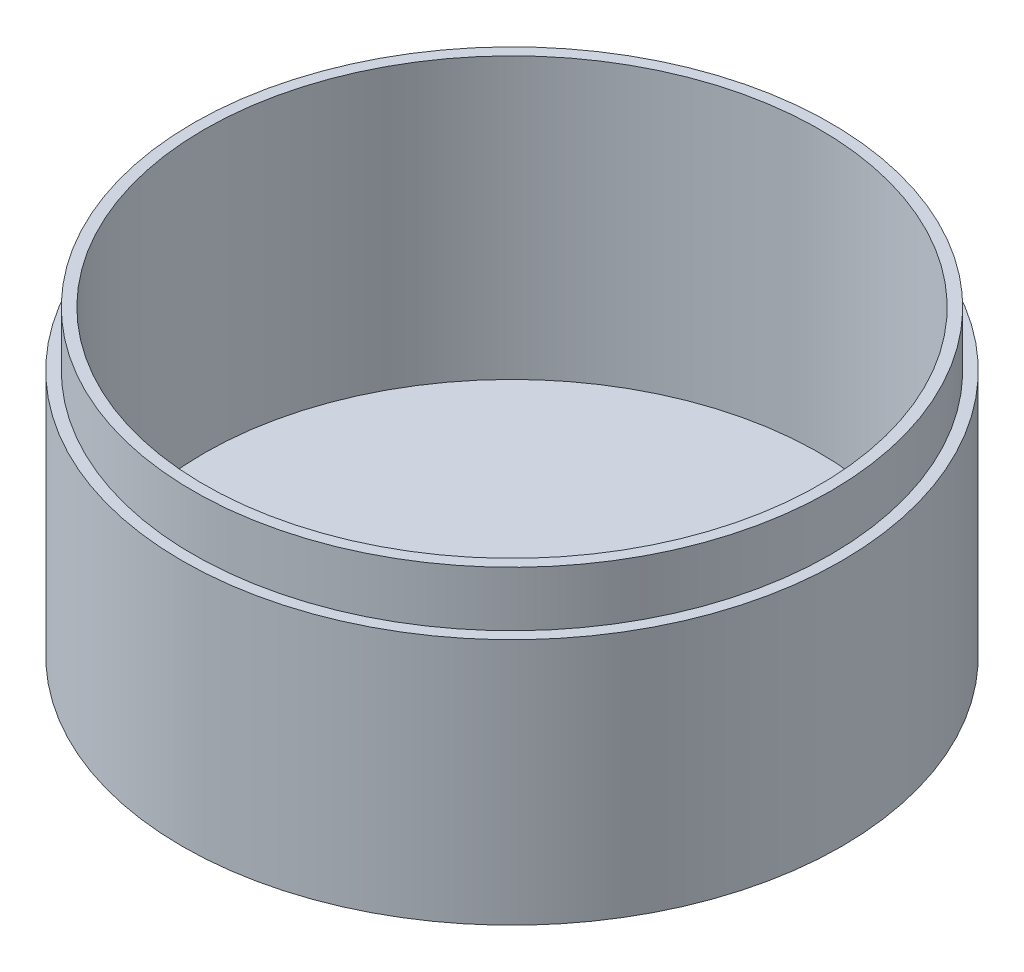
ISO-10303-21;
HEADER;
FILE_DESCRIPTION(('STEP AP214'),'2;1');
FILE_NAME('part.step','',(''),(''),'','','');
FILE_SCHEMA(('AUTOMOTIVE_DESIGN { 1 0 10303 214 1 1 1 1 }'));
ENDSEC;
DATA;
#1=APPLICATION_CONTEXT('core data for automotive mechanical design processes');
#2=APPLICATION_PROTOCOL_DEFINITION('international standard','automotive_design',2000,#1);
#3=PRODUCT_CONTEXT('',#1,'mechanical');
#4=PRODUCT('Part','Part','',(#3));
#5=PRODUCT_RELATED_PRODUCT_CATEGORY('part','',(#4));
#6=PRODUCT_DEFINITION_FORMATION('','',#4);
#7=PRODUCT_DEFINITION_CONTEXT('part definition',#1,'design');
#8=PRODUCT_DEFINITION('design','',#6,#7);
#9=PRODUCT_DEFINITION_SHAPE('','',#8);
#10=(LENGTH_UNIT() NAMED_UNIT(*) SI_UNIT(.MILLI.,.METRE.));
#11=(NAMED_UNIT(*) PLANE_ANGLE_UNIT() SI_UNIT($,.RADIAN.));
#12=(NAMED_UNIT(*) SI_UNIT($,.STERADIAN.) SOLID_ANGLE_UNIT());
#13=UNCERTAINTY_MEASURE_WITH_UNIT(LENGTH_MEASURE(1.E-05),#10,'distance_accuracy_value','');
#14=(GEOMETRIC_REPRESENTATION_CONTEXT(3) GLOBAL_UNCERTAINTY_ASSIGNED_CONTEXT((#13)) GLOBAL_UNIT_ASSIGNED_CONTEXT((#10,
#11,#12)) REPRESENTATION_CONTEXT('',''));
#15=CARTESIAN_POINT('',(0.,0.,0.));
#16=DIRECTION('',(0.,0.,1.));
#17=DIRECTION('',(1.,0.,0.));
#18=AXIS2_PLACEMENT_3D('',#15,#16,#17);
#19=CARTESIAN_POINT('',(0.,0.,0.));
#20=DIRECTION('',(0.,1.,0.));
#21=DIRECTION('',(-1.,0.,0.));
#22=AXIS2_PLACEMENT_3D('',#19,#20,#21);
#23=PLANE('',#22);
#24=CARTESIAN_POINT('',(0.,0.,0.));
#25=DIRECTION('',(0.,1.,0.));
#26=DIRECTION('',(-1.,0.,0.));
#27=AXIS2_PLACEMENT_3D('',#24,#25,#26);
#28=CIRCLE('',#27,76.2);
#29=CARTESIAN_POINT('',(-76.2,0.,0.));
#30=VERTEX_POINT('',#29);
#31=EDGE_CURVE('E10',#30,#30,#28,.T.);
#32=ORIENTED_EDGE('',*,*,#31,.F.);
#33=EDGE_LOOP('',(#32));
#34=FACE_BOUND('',#33,.T.);
#35=ADVANCED_FACE('F31',(#34),#23,.F.);
#36=CARTESIAN_POINT('',(0.,5.08,0.));
#37=DIRECTION('',(0.,1.,0.));
#38=DIRECTION('',(-1.,0.,0.));
#39=AXIS2_PLACEMENT_3D('',#36,#37,#38);
#40=CYLINDRICAL_SURFACE('',#39,76.2);
#41=CARTESIAN_POINT('',(0.,57.15,0.));
#42=DIRECTION('',(0.,1.,0.));
#43=DIRECTION('',(-1.,0.,0.));
#44=AXIS2_PLACEMENT_3D('',#41,#42,#43);
#45=CIRCLE('',#44,76.2);
#46=CARTESIAN_POINT('',(-76.2,57.15,0.));
#47=VERTEX_POINT('',#46);
#48=EDGE_CURVE('E37',#47,#47,#45,.T.);
#49=ORIENTED_EDGE('',*,*,#48,.F.);
#50=EDGE_LOOP('',(#49));
#51=FACE_BOUND('',#50,.T.);
#52=ORIENTED_EDGE('',*,*,#31,.T.);
#53=EDGE_LOOP('',(#52));
#54=FACE_BOUND('',#53,.T.);
#55=ADVANCED_FACE('F79',(#51,#54),#40,.T.);
#56=CARTESIAN_POINT('',(76.2,57.15,0.));
#57=DIRECTION('',(0.,-1.,0.));
#58=DIRECTION('',(1.,0.,0.));
#59=AXIS2_PLACEMENT_3D('',#56,#57,#58);
#60=PLANE('',#59);
#61=CARTESIAN_POINT('',(0.,57.15,0.));
#62=DIRECTION('',(0.,1.,0.));
#63=DIRECTION('',(-1.,0.,0.));
#64=AXIS2_PLACEMENT_3D('',#61,#62,#63);
#65=CIRCLE('',#64,73.66);
#66=CARTESIAN_POINT('',(-73.66,57.15,0.));
#67=VERTEX_POINT('',#66);
#68=EDGE_CURVE('E41',#67,#67,#65,.T.);
#69=ORIENTED_EDGE('',*,*,#68,.F.);
#70=EDGE_LOOP('',(#69));
#71=FACE_BOUND('',#70,.T.);
#72=ORIENTED_EDGE('',*,*,#48,.T.);
#73=EDGE_LOOP('',(#72));
#74=FACE_BOUND('',#73,.T.);
#75=ADVANCED_FACE('F74',(#71,#74),#60,.F.);
#76=CARTESIAN_POINT('',(0.,5.08,0.));
#77=DIRECTION('',(0.,1.,0.));
#78=DIRECTION('',(-1.,0.,0.));
#79=AXIS2_PLACEMENT_3D('',#76,#77,#78);
#80=CYLINDRICAL_SURFACE('',#79,73.66);
#81=CARTESIAN_POINT('',(0.,69.85,0.));
#82=DIRECTION('',(0.,1.,0.));
#83=DIRECTION('',(-1.,0.,0.));
#84=AXIS2_PLACEMENT_3D('',#81,#82,#83);
#85=CIRCLE('',#84,73.66);
#86=CARTESIAN_POINT('',(-73.66,69.85,0.));
#87=VERTEX_POINT('',#86);
#88=EDGE_CURVE('E45',#87,#87,#85,.T.);
#89=ORIENTED_EDGE('',*,*,#88,.F.);
#90=EDGE_LOOP('',(#89));
#91=FACE_BOUND('',#90,.T.);
#92=ORIENTED_EDGE('',*,*,#68,.T.);
#93=EDGE_LOOP('',(#92));
#94=FACE_BOUND('',#93,.T.);
#95=ADVANCED_FACE('F68',(#91,#94),#80,.T.);
#96=CARTESIAN_POINT('',(73.66,69.85,0.));
#97=DIRECTION('',(0.,-1.,0.));
#98=DIRECTION('',(1.,0.,0.));
#99=AXIS2_PLACEMENT_3D('',#96,#97,#98);
#100=PLANE('',#99);
#101=CARTESIAN_POINT('',(0.,69.85,0.));
#102=DIRECTION('',(0.,1.,0.));
#103=DIRECTION('',(-1.,0.,0.));
#104=AXIS2_PLACEMENT_3D('',#101,#102,#103);
#105=CIRCLE('',#104,71.12);
#106=CARTESIAN_POINT('',(-71.12,69.85,0.));
#107=VERTEX_POINT('',#106);
#108=EDGE_CURVE('E50',#107,#107,#105,.T.);
#109=ORIENTED_EDGE('',*,*,#108,.F.);
#110=EDGE_LOOP('',(#109));
#111=FACE_BOUND('',#110,.T.);
#112=ORIENTED_EDGE('',*,*,#88,.T.);
#113=EDGE_LOOP('',(#112));
#114=FACE_BOUND('',#113,.T.);
#115=ADVANCED_FACE('F62',(#111,#114),#100,.F.);
#116=CARTESIAN_POINT('',(0.,5.08,0.));
#117=DIRECTION('',(0.,1.,0.));
#118=DIRECTION('',(-1.,0.,0.));
#119=AXIS2_PLACEMENT_3D('',#116,#117,#118);
#120=CYLINDRICAL_SURFACE('',#119,71.12);
#121=CARTESIAN_POINT('',(0.,5.08000000000001,0.));
#122=DIRECTION('',(0.,1.,0.));
#123=DIRECTION('',(-1.,0.,0.));
#124=AXIS2_PLACEMENT_3D('',#121,#122,#123);
#125=CIRCLE('',#124,71.12);
#126=CARTESIAN_POINT('',(-71.12,5.08000000000001,0.));
#127=VERTEX_POINT('',#126);
#128=EDGE_CURVE('E53',#127,#127,#125,.T.);
#129=ORIENTED_EDGE('',*,*,#128,.F.);
#130=EDGE_LOOP('',(#129));
#131=FACE_BOUND('',#130,.T.);
#132=ORIENTED_EDGE('',*,*,#108,.T.);
#133=EDGE_LOOP('',(#132));
#134=FACE_BOUND('',#133,.T.);
#135=ADVANCED_FACE('F59',(#131,#134),#120,.F.);
#136=CARTESIAN_POINT('',(71.12,5.08,0.));
#137=DIRECTION('',(0.,-1.,0.));
#138=DIRECTION('',(1.,0.,0.));
#139=AXIS2_PLACEMENT_3D('',#136,#137,#138);
#140=PLANE('',#139);
#141=ORIENTED_EDGE('',*,*,#128,.T.);
#142=EDGE_LOOP('',(#141));
#143=FACE_BOUND('',#142,.T.);
#144=ADVANCED_FACE('F57',(#143),#140,.F.);
#145=CLOSED_SHELL('',(#35,#55,#75,#95,#115,#135,#144));
#146=MANIFOLD_SOLID_BREP('B2',#145);
#147=ADVANCED_BREP_SHAPE_REPRESENTATION('',(#18,#146),#14);
#148=SHAPE_DEFINITION_REPRESENTATION(#9,#147);
ENDSEC;
END-ISO-10303-21;
